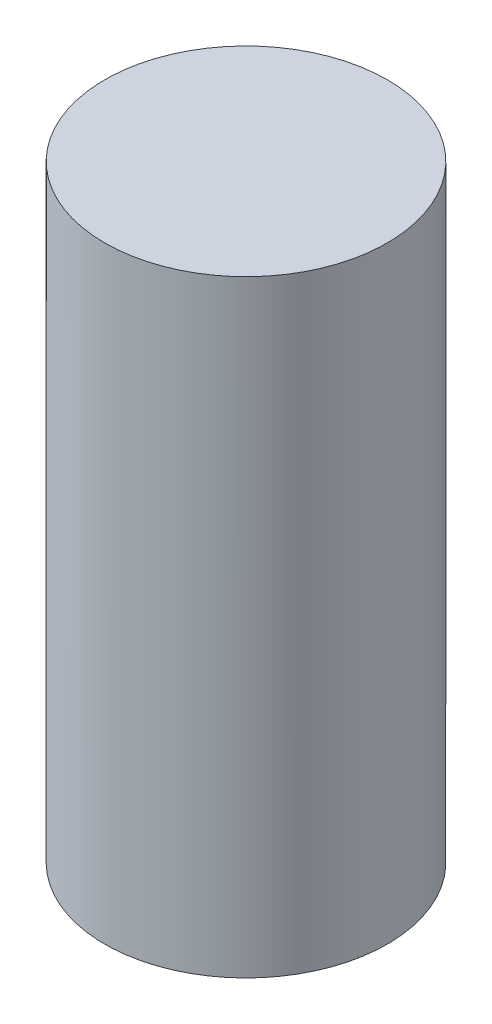
ISO-10303-21;
HEADER;
FILE_DESCRIPTION(('STEP AP214'),'2;1');
FILE_NAME('part.step','',(''),(''),'','','');
FILE_SCHEMA(('AUTOMOTIVE_DESIGN { 1 0 10303 214 1 1 1 1 }'));
ENDSEC;
DATA;
#1=APPLICATION_CONTEXT('core data for automotive mechanical design processes');
#2=APPLICATION_PROTOCOL_DEFINITION('international standard','automotive_design',2000,#1);
#3=PRODUCT_CONTEXT('',#1,'mechanical');
#4=PRODUCT('Part','Part','',(#3));
#5=PRODUCT_RELATED_PRODUCT_CATEGORY('part','',(#4));
#6=PRODUCT_DEFINITION_FORMATION('','',#4);
#7=PRODUCT_DEFINITION_CONTEXT('part definition',#1,'design');
#8=PRODUCT_DEFINITION('design','',#6,#7);
#9=PRODUCT_DEFINITION_SHAPE('','',#8);
#10=(LENGTH_UNIT() NAMED_UNIT(*) SI_UNIT(.MILLI.,.METRE.));
#11=(NAMED_UNIT(*) PLANE_ANGLE_UNIT() SI_UNIT($,.RADIAN.));
#12=(NAMED_UNIT(*) SI_UNIT($,.STERADIAN.) SOLID_ANGLE_UNIT());
#13=UNCERTAINTY_MEASURE_WITH_UNIT(LENGTH_MEASURE(1.E-05),#10,'distance_accuracy_value','');
#14=(GEOMETRIC_REPRESENTATION_CONTEXT(3) GLOBAL_UNCERTAINTY_ASSIGNED_CONTEXT((#13)) GLOBAL_UNIT_ASSIGNED_CONTEXT((#10,
#11,#12)) REPRESENTATION_CONTEXT('',''));
#15=CARTESIAN_POINT('',(0.,0.,0.));
#16=DIRECTION('',(0.,0.,1.));
#17=DIRECTION('',(1.,0.,0.));
#18=AXIS2_PLACEMENT_3D('',#15,#16,#17);
#19=CARTESIAN_POINT('',(0.,320.,0.));
#20=DIRECTION('',(0.,-1.,0.));
#21=DIRECTION('',(0.,0.,-1.));
#22=AXIS2_PLACEMENT_3D('',#19,#20,#21);
#23=CYLINDRICAL_SURFACE('',#22,73.61);
#24=CARTESIAN_POINT('',(0.,320.,0.));
#25=DIRECTION('',(0.,1.,0.));
#26=DIRECTION('',(0.,0.,1.));
#27=AXIS2_PLACEMENT_3D('',#24,#25,#26);
#28=CIRCLE('',#27,73.61);
#29=CARTESIAN_POINT('',(0.,320.,73.61));
#30=VERTEX_POINT('',#29);
#31=EDGE_CURVE('E10',#30,#30,#28,.T.);
#32=ORIENTED_EDGE('',*,*,#31,.F.);
#33=EDGE_LOOP('',(#32));
#34=FACE_BOUND('',#33,.T.);
#35=CARTESIAN_POINT('',(0.,3.61660981659384,0.));
#36=DIRECTION('',(0.,-1.,0.));
#37=DIRECTION('',(0.,0.,-1.));
#38=AXIS2_PLACEMENT_3D('',#35,#36,#37);
#39=CIRCLE('',#38,73.61);
#40=CARTESIAN_POINT('',(0.,3.61660981659384,-73.61));
#41=VERTEX_POINT('',#40);
#42=EDGE_CURVE('E37',#41,#41,#39,.T.);
#43=ORIENTED_EDGE('',*,*,#42,.F.);
#44=EDGE_LOOP('',(#43));
#45=FACE_BOUND('',#44,.T.);
#46=ADVANCED_FACE('F34',(#34,#45),#23,.T.);
#47=CARTESIAN_POINT('',(0.,320.,0.));
#48=DIRECTION('',(0.,1.,0.));
#49=DIRECTION('',(0.,0.,1.));
#50=AXIS2_PLACEMENT_3D('',#47,#48,#49);
#51=PLANE('',#50);
#52=ORIENTED_EDGE('',*,*,#31,.T.);
#53=EDGE_LOOP('',(#52));
#54=FACE_BOUND('',#53,.T.);
#55=ADVANCED_FACE('F66',(#54),#51,.T.);
#56=CARTESIAN_POINT('',(61.120836468629,3.61660981659384,0.));
#57=DIRECTION('',(0.,-1.,0.));
#58=DIRECTION('',(0.,0.,-1.));
#59=AXIS2_PLACEMENT_3D('',#56,#57,#58);
#60=PLANE('',#59);
#61=CARTESIAN_POINT('',(0.,3.61660981659384,0.));
#62=DIRECTION('',(0.,1.,0.));
#63=DIRECTION('',(0.,0.,1.));
#64=AXIS2_PLACEMENT_3D('',#61,#62,#63);
#65=CIRCLE('',#64,61.120836468629);
#66=CARTESIAN_POINT('',(0.,3.61660981659384,61.120836468629));
#67=VERTEX_POINT('',#66);
#68=EDGE_CURVE('E47',#67,#67,#65,.T.);
#69=ORIENTED_EDGE('',*,*,#68,.T.);
#70=EDGE_LOOP('',(#69));
#71=FACE_BOUND('',#70,.T.);
#72=ORIENTED_EDGE('',*,*,#42,.T.);
#73=EDGE_LOOP('',(#72));
#74=FACE_BOUND('',#73,.T.);
#75=ADVANCED_FACE('F54',(#71,#74),#60,.T.);
#76=CARTESIAN_POINT('',(0.,187.934132292303,0.));
#77=DIRECTION('',(0.,1.,0.));
#78=DIRECTION('',(0.,0.,1.));
#79=AXIS2_PLACEMENT_3D('',#76,#77,#78);
#80=CYLINDRICAL_SURFACE('',#79,61.120836468629);
#81=ORIENTED_EDGE('',*,*,#68,.F.);
#82=EDGE_LOOP('',(#81));
#83=FACE_BOUND('',#82,.T.);
#84=CARTESIAN_POINT('',(0.,0.,0.));
#85=DIRECTION('',(0.,1.,0.));
#86=DIRECTION('',(0.,0.,1.));
#87=AXIS2_PLACEMENT_3D('',#84,#85,#86);
#88=CIRCLE('',#87,61.120836468629);
#89=CARTESIAN_POINT('',(0.,0.,61.120836468629));
#90=VERTEX_POINT('',#89);
#91=EDGE_CURVE('E45',#90,#90,#88,.T.);
#92=ORIENTED_EDGE('',*,*,#91,.T.);
#93=EDGE_LOOP('',(#92));
#94=FACE_BOUND('',#93,.T.);
#95=ADVANCED_FACE('F57',(#83,#94),#80,.T.);
#96=CARTESIAN_POINT('',(0.,0.,0.));
#97=DIRECTION('',(0.,1.,0.));
#98=DIRECTION('',(0.,0.,1.));
#99=AXIS2_PLACEMENT_3D('',#96,#97,#98);
#100=PLANE('',#99);
#101=ORIENTED_EDGE('',*,*,#91,.F.);
#102=EDGE_LOOP('',(#101));
#103=FACE_BOUND('',#102,.T.);
#104=ADVANCED_FACE('F59',(#103),#100,.F.);
#105=CLOSED_SHELL('',(#46,#55,#75,#95,#104));
#106=MANIFOLD_SOLID_BREP('B2',#105);
#107=ADVANCED_BREP_SHAPE_REPRESENTATION('',(#18,#106),#14);
#108=SHAPE_DEFINITION_REPRESENTATION(#9,#107);
ENDSEC;
END-ISO-10303-21;
